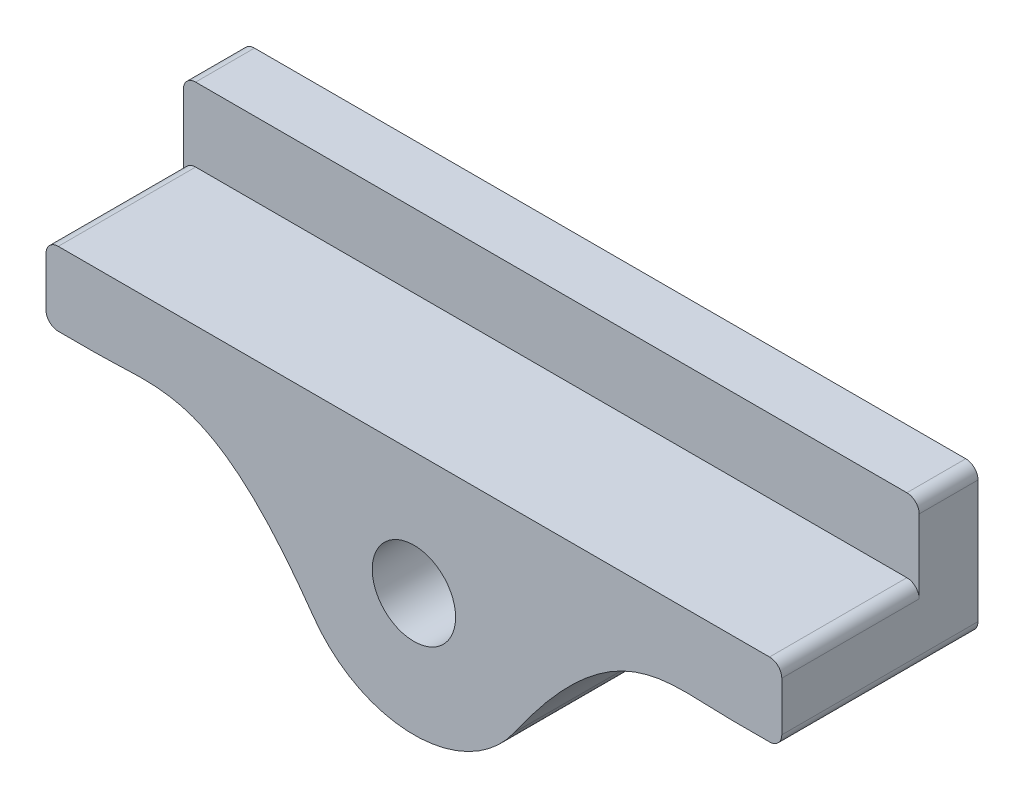
ISO-10303-21;
HEADER;
FILE_DESCRIPTION(('STEP AP214'),'2;1');
FILE_NAME('part.step','',(''),(''),'','','');
FILE_SCHEMA(('AUTOMOTIVE_DESIGN { 1 0 10303 214 1 1 1 1 }'));
ENDSEC;
DATA;
#1=APPLICATION_CONTEXT('core data for automotive mechanical design processes');
#2=APPLICATION_PROTOCOL_DEFINITION('international standard','automotive_design',2000,#1);
#3=PRODUCT_CONTEXT('',#1,'mechanical');
#4=PRODUCT('Part','Part','',(#3));
#5=PRODUCT_RELATED_PRODUCT_CATEGORY('part','',(#4));
#6=PRODUCT_DEFINITION_FORMATION('','',#4);
#7=PRODUCT_DEFINITION_CONTEXT('part definition',#1,'design');
#8=PRODUCT_DEFINITION('design','',#6,#7);
#9=PRODUCT_DEFINITION_SHAPE('','',#8);
#10=(LENGTH_UNIT() NAMED_UNIT(*) SI_UNIT(.MILLI.,.METRE.));
#11=(NAMED_UNIT(*) PLANE_ANGLE_UNIT() SI_UNIT($,.RADIAN.));
#12=(NAMED_UNIT(*) SI_UNIT($,.STERADIAN.) SOLID_ANGLE_UNIT());
#13=UNCERTAINTY_MEASURE_WITH_UNIT(LENGTH_MEASURE(1.E-05),#10,'distance_accuracy_value','');
#14=(GEOMETRIC_REPRESENTATION_CONTEXT(3) GLOBAL_UNCERTAINTY_ASSIGNED_CONTEXT((#13)) GLOBAL_UNIT_ASSIGNED_CONTEXT((#10,
#11,#12)) REPRESENTATION_CONTEXT('',''));
#15=CARTESIAN_POINT('',(0.,0.,0.));
#16=DIRECTION('',(0.,0.,1.));
#17=DIRECTION('',(1.,0.,0.));
#18=AXIS2_PLACEMENT_3D('',#15,#16,#17);
#19=CARTESIAN_POINT('',(5.,-2.,1.));
#20=DIRECTION('',(0.,0.,-1.));
#21=DIRECTION('',(-1.,0.,0.));
#22=AXIS2_PLACEMENT_3D('',#19,#20,#21);
#23=CYLINDRICAL_SURFACE('',#22,3.7);
#24=CARTESIAN_POINT('',(5.,-2.,0.));
#25=DIRECTION('',(0.,0.,-1.));
#26=DIRECTION('',(-1.,0.,0.));
#27=AXIS2_PLACEMENT_3D('',#24,#25,#26);
#28=CIRCLE('',#27,3.7);
#29=CARTESIAN_POINT('',(1.3,-2.,0.));
#30=VERTEX_POINT('',#29);
#31=EDGE_CURVE('E410',#30,#30,#28,.T.);
#32=ORIENTED_EDGE('',*,*,#31,.T.);
#33=EDGE_LOOP('',(#32));
#34=FACE_BOUND('',#33,.T.);
#35=CARTESIAN_POINT('',(5.,-2.,0.6));
#36=DIRECTION('',(0.,0.,1.));
#37=DIRECTION('',(1.,0.,0.));
#38=AXIS2_PLACEMENT_3D('',#35,#36,#37);
#39=CIRCLE('',#38,3.7);
#40=CARTESIAN_POINT('',(8.7,-2.,0.6));
#41=VERTEX_POINT('',#40);
#42=EDGE_CURVE('E11',#41,#41,#39,.F.);
#43=ORIENTED_EDGE('',*,*,#42,.F.);
#44=EDGE_LOOP('',(#43));
#45=FACE_BOUND('',#44,.T.);
#46=ADVANCED_FACE('F35',(#34,#45),#23,.F.);
#47=CARTESIAN_POINT('',(5.,-2.,8.));
#48=DIRECTION('',(0.,0.,-1.));
#49=DIRECTION('',(-1.,0.,0.));
#50=AXIS2_PLACEMENT_3D('',#47,#48,#49);
#51=CYLINDRICAL_SURFACE('',#50,1.7);
#52=CARTESIAN_POINT('',(5.,-2.,3.4));
#53=DIRECTION('',(0.,0.,1.));
#54=DIRECTION('',(1.,0.,0.));
#55=AXIS2_PLACEMENT_3D('',#52,#53,#54);
#56=CIRCLE('',#55,1.7);
#57=CARTESIAN_POINT('',(6.7,-2.,3.4));
#58=VERTEX_POINT('',#57);
#59=EDGE_CURVE('E45',#58,#58,#56,.T.);
#60=ORIENTED_EDGE('',*,*,#59,.F.);
#61=EDGE_LOOP('',(#60));
#62=FACE_BOUND('',#61,.T.);
#63=CARTESIAN_POINT('',(5.,-2.,8.));
#64=DIRECTION('',(0.,0.,1.));
#65=DIRECTION('',(1.,0.,0.));
#66=AXIS2_PLACEMENT_3D('',#63,#64,#65);
#67=CIRCLE('',#66,1.7);
#68=CARTESIAN_POINT('',(6.7,-2.,8.));
#69=VERTEX_POINT('',#68);
#70=EDGE_CURVE('E290',#69,#69,#67,.T.);
#71=ORIENTED_EDGE('',*,*,#70,.T.);
#72=EDGE_LOOP('',(#71));
#73=FACE_BOUND('',#72,.T.);
#74=ADVANCED_FACE('F239',(#62,#73),#51,.F.);
#75=CARTESIAN_POINT('',(-4.03421233914941,-0.267444983879889,8.));
#76=DIRECTION('',(0.,0.,-1.));
#77=DIRECTION('',(-1.,0.,0.));
#78=AXIS2_PLACEMENT_3D('',#75,#76,#77);
#79=PLANE('',#78);
#80=DIRECTION('',(0.,-1.,0.));
#81=VECTOR('',#80,1.);
#82=CARTESIAN_POINT('',(-10.,6.,8.));
#83=LINE('',#82,#81);
#84=CARTESIAN_POINT('',(-10.,2.5,8.));
#85=VERTEX_POINT('',#84);
#86=CARTESIAN_POINT('',(-10.,0.5,8.));
#87=VERTEX_POINT('',#86);
#88=EDGE_CURVE('E163',#85,#87,#83,.T.);
#89=ORIENTED_EDGE('',*,*,#88,.T.);
#90=CARTESIAN_POINT('',(-9.5,0.5,8.));
#91=DIRECTION('',(0.,0.,-1.));
#92=DIRECTION('',(-1.,0.,0.));
#93=AXIS2_PLACEMENT_3D('',#90,#91,#92);
#94=CIRCLE('',#93,0.5);
#95=CARTESIAN_POINT('',(-9.5,0.,8.));
#96=VERTEX_POINT('',#95);
#97=EDGE_CURVE('E159',#87,#96,#94,.F.);
#98=ORIENTED_EDGE('',*,*,#97,.T.);
#99=DIRECTION('',(1.,0.,0.));
#100=VECTOR('',#99,1.);
#101=CARTESIAN_POINT('',(-8.,0.,8.));
#102=LINE('',#101,#100);
#103=CARTESIAN_POINT('',(-8.,0.,8.));
#104=VERTEX_POINT('',#103);
#105=EDGE_CURVE('E150',#96,#104,#102,.T.);
#106=ORIENTED_EDGE('',*,*,#105,.T.);
#107=CARTESIAN_POINT('',(-8.,0.,8.));
#108=CARTESIAN_POINT('',(-5.26031875300334,0.,8.));
#109=CARTESIAN_POINT('',(-3.13135456391697,0.908049893895382,8.));
#110=CARTESIAN_POINT('',(0.901321237565681,-4.86370955272525,8.));
#111=B_SPLINE_CURVE_WITH_KNOTS('',3,(#107,#108,#109,#110),.UNSPECIFIED.,.F.,.F.,(4,4),(0.,1.),.UNSPECIFIED.);
#112=CARTESIAN_POINT('',(0.901321237565678,-4.86370955272525,8.));
#113=VERTEX_POINT('',#112);
#114=EDGE_CURVE('E156',#104,#113,#111,.T.);
#115=ORIENTED_EDGE('',*,*,#114,.T.);
#116=CARTESIAN_POINT('',(5.,-2.,8.));
#117=DIRECTION('',(0.,0.,1.));
#118=DIRECTION('',(1.,0.,0.));
#119=AXIS2_PLACEMENT_3D('',#116,#117,#118);
#120=CIRCLE('',#119,5.);
#121=CARTESIAN_POINT('',(9.09867876243432,-4.86370955272525,8.));
#122=VERTEX_POINT('',#121);
#123=EDGE_CURVE('E178',#113,#122,#120,.T.);
#124=ORIENTED_EDGE('',*,*,#123,.T.);
#125=CARTESIAN_POINT('',(9.09867876243432,-4.86370955272525,8.));
#126=CARTESIAN_POINT('',(13.131354563917,0.908049893895381,8.));
#127=CARTESIAN_POINT('',(15.2603187530033,0.,8.));
#128=CARTESIAN_POINT('',(18.,0.,8.));
#129=B_SPLINE_CURVE_WITH_KNOTS('',3,(#125,#126,#127,#128),.UNSPECIFIED.,.F.,.F.,(4,4),(0.,1.),.UNSPECIFIED.);
#130=CARTESIAN_POINT('',(18.,0.,8.));
#131=VERTEX_POINT('',#130);
#132=EDGE_CURVE('E180',#122,#131,#129,.T.);
#133=ORIENTED_EDGE('',*,*,#132,.T.);
#134=DIRECTION('',(1.,0.,0.));
#135=VECTOR('',#134,1.);
#136=CARTESIAN_POINT('',(18.,0.,8.));
#137=LINE('',#136,#135);
#138=CARTESIAN_POINT('',(19.5,0.,8.));
#139=VERTEX_POINT('',#138);
#140=EDGE_CURVE('E276',#131,#139,#137,.T.);
#141=ORIENTED_EDGE('',*,*,#140,.T.);
#142=CARTESIAN_POINT('',(19.5,0.5,8.));
#143=DIRECTION('',(0.,0.,-1.));
#144=DIRECTION('',(-1.,0.,0.));
#145=AXIS2_PLACEMENT_3D('',#142,#143,#144);
#146=CIRCLE('',#145,0.5);
#147=CARTESIAN_POINT('',(20.,0.5,8.));
#148=VERTEX_POINT('',#147);
#149=EDGE_CURVE('E343',#139,#148,#146,.F.);
#150=ORIENTED_EDGE('',*,*,#149,.T.);
#151=DIRECTION('',(0.,1.,0.));
#152=VECTOR('',#151,1.);
#153=CARTESIAN_POINT('',(20.,6.,8.));
#154=LINE('',#153,#152);
#155=CARTESIAN_POINT('',(20.,2.5,8.));
#156=VERTEX_POINT('',#155);
#157=EDGE_CURVE('E282',#148,#156,#154,.T.);
#158=ORIENTED_EDGE('',*,*,#157,.T.);
#159=CARTESIAN_POINT('',(19.5,2.5,8.));
#160=DIRECTION('',(0.,0.,-1.));
#161=DIRECTION('',(-1.,0.,0.));
#162=AXIS2_PLACEMENT_3D('',#159,#160,#161);
#163=CIRCLE('',#162,0.5);
#164=CARTESIAN_POINT('',(19.5,3.,8.));
#165=VERTEX_POINT('',#164);
#166=EDGE_CURVE('E341',#156,#165,#163,.F.);
#167=ORIENTED_EDGE('',*,*,#166,.T.);
#168=DIRECTION('',(1.,0.,0.));
#169=VECTOR('',#168,1.);
#170=CARTESIAN_POINT('',(-10.,3.,8.));
#171=LINE('',#170,#169);
#172=CARTESIAN_POINT('',(-9.5,3.,8.));
#173=VERTEX_POINT('',#172);
#174=EDGE_CURVE('E385',#173,#165,#171,.T.);
#175=ORIENTED_EDGE('',*,*,#174,.F.);
#176=CARTESIAN_POINT('',(-9.5,2.5,8.));
#177=DIRECTION('',(0.,0.,-1.));
#178=DIRECTION('',(-1.,0.,0.));
#179=AXIS2_PLACEMENT_3D('',#176,#177,#178);
#180=CIRCLE('',#179,0.5);
#181=EDGE_CURVE('E339',#173,#85,#180,.F.);
#182=ORIENTED_EDGE('',*,*,#181,.T.);
#183=EDGE_LOOP('',(#89,#98,#106,#115,#124,#133,#141,#150,#158,#167,#175,#182));
#184=FACE_BOUND('',#183,.T.);
#185=ORIENTED_EDGE('',*,*,#70,.F.);
#186=EDGE_LOOP('',(#185));
#187=FACE_BOUND('',#186,.T.);
#188=ADVANCED_FACE('F153',(#184,#187),#79,.F.);
#189=CARTESIAN_POINT('',(-4.03421233914941,-0.267444983879889,0.));
#190=DIRECTION('',(0.,0.,-1.));
#191=DIRECTION('',(-1.,0.,0.));
#192=AXIS2_PLACEMENT_3D('',#189,#190,#191);
#193=PLANE('',#192);
#194=ORIENTED_EDGE('',*,*,#31,.F.);
#195=EDGE_LOOP('',(#194));
#196=FACE_BOUND('',#195,.T.);
#197=DIRECTION('',(1.,0.,0.));
#198=VECTOR('',#197,1.);
#199=CARTESIAN_POINT('',(-8.,0.,0.));
#200=LINE('',#199,#198);
#201=CARTESIAN_POINT('',(-9.5,0.,0.));
#202=VERTEX_POINT('',#201);
#203=CARTESIAN_POINT('',(-8.,0.,0.));
#204=VERTEX_POINT('',#203);
#205=EDGE_CURVE('E169',#202,#204,#200,.T.);
#206=ORIENTED_EDGE('',*,*,#205,.F.);
#207=CARTESIAN_POINT('',(-9.5,0.5,0.));
#208=DIRECTION('',(0.,0.,-1.));
#209=DIRECTION('',(-1.,0.,0.));
#210=AXIS2_PLACEMENT_3D('',#207,#208,#209);
#211=CIRCLE('',#210,0.5);
#212=CARTESIAN_POINT('',(-10.,0.5,0.));
#213=VERTEX_POINT('',#212);
#214=EDGE_CURVE('E329',#202,#213,#211,.T.);
#215=ORIENTED_EDGE('',*,*,#214,.T.);
#216=DIRECTION('',(0.,-1.,0.));
#217=VECTOR('',#216,1.);
#218=CARTESIAN_POINT('',(-10.,6.,0.));
#219=LINE('',#218,#217);
#220=CARTESIAN_POINT('',(-10.,5.5,0.));
#221=VERTEX_POINT('',#220);
#222=EDGE_CURVE('E289',#221,#213,#219,.T.);
#223=ORIENTED_EDGE('',*,*,#222,.F.);
#224=CARTESIAN_POINT('',(-9.5,5.5,0.));
#225=DIRECTION('',(0.,0.,-1.));
#226=DIRECTION('',(-1.,0.,0.));
#227=AXIS2_PLACEMENT_3D('',#224,#225,#226);
#228=CIRCLE('',#227,0.5);
#229=CARTESIAN_POINT('',(-9.5,6.,0.));
#230=VERTEX_POINT('',#229);
#231=EDGE_CURVE('E323',#221,#230,#228,.T.);
#232=ORIENTED_EDGE('',*,*,#231,.T.);
#233=DIRECTION('',(-1.,0.,0.));
#234=VECTOR('',#233,1.);
#235=CARTESIAN_POINT('',(20.,6.,0.));
#236=LINE('',#235,#234);
#237=CARTESIAN_POINT('',(19.5,6.,0.));
#238=VERTEX_POINT('',#237);
#239=EDGE_CURVE('E286',#238,#230,#236,.T.);
#240=ORIENTED_EDGE('',*,*,#239,.F.);
#241=CARTESIAN_POINT('',(19.5,5.5,0.));
#242=DIRECTION('',(0.,0.,-1.));
#243=DIRECTION('',(-1.,0.,0.));
#244=AXIS2_PLACEMENT_3D('',#241,#242,#243);
#245=CIRCLE('',#244,0.5);
#246=CARTESIAN_POINT('',(20.,5.5,0.));
#247=VERTEX_POINT('',#246);
#248=EDGE_CURVE('E325',#238,#247,#245,.T.);
#249=ORIENTED_EDGE('',*,*,#248,.T.);
#250=DIRECTION('',(0.,1.,0.));
#251=VECTOR('',#250,1.);
#252=CARTESIAN_POINT('',(20.,6.,0.));
#253=LINE('',#252,#251);
#254=CARTESIAN_POINT('',(20.,0.5,0.));
#255=VERTEX_POINT('',#254);
#256=EDGE_CURVE('E313',#255,#247,#253,.T.);
#257=ORIENTED_EDGE('',*,*,#256,.F.);
#258=CARTESIAN_POINT('',(19.5,0.5,0.));
#259=DIRECTION('',(0.,0.,-1.));
#260=DIRECTION('',(-1.,0.,0.));
#261=AXIS2_PLACEMENT_3D('',#258,#259,#260);
#262=CIRCLE('',#261,0.5);
#263=CARTESIAN_POINT('',(19.5,0.,0.));
#264=VERTEX_POINT('',#263);
#265=EDGE_CURVE('E327',#255,#264,#262,.T.);
#266=ORIENTED_EDGE('',*,*,#265,.T.);
#267=DIRECTION('',(1.,0.,0.));
#268=VECTOR('',#267,1.);
#269=CARTESIAN_POINT('',(18.,0.,0.));
#270=LINE('',#269,#268);
#271=CARTESIAN_POINT('',(18.,0.,0.));
#272=VERTEX_POINT('',#271);
#273=EDGE_CURVE('E307',#272,#264,#270,.T.);
#274=ORIENTED_EDGE('',*,*,#273,.F.);
#275=CARTESIAN_POINT('',(9.09867876243432,-4.86370955272525,0.));
#276=CARTESIAN_POINT('',(13.131354563917,0.908049893895381,0.));
#277=CARTESIAN_POINT('',(15.2603187530033,0.,0.));
#278=CARTESIAN_POINT('',(18.,0.,0.));
#279=B_SPLINE_CURVE_WITH_KNOTS('',3,(#275,#276,#277,#278),.UNSPECIFIED.,.F.,.F.,(4,4),(0.,1.),.UNSPECIFIED.);
#280=CARTESIAN_POINT('',(9.09867876243432,-4.86370955272525,0.));
#281=VERTEX_POINT('',#280);
#282=EDGE_CURVE('E303',#281,#272,#279,.T.);
#283=ORIENTED_EDGE('',*,*,#282,.F.);
#284=CARTESIAN_POINT('',(5.,-2.,0.));
#285=DIRECTION('',(0.,0.,1.));
#286=DIRECTION('',(1.,0.,0.));
#287=AXIS2_PLACEMENT_3D('',#284,#285,#286);
#288=CIRCLE('',#287,5.);
#289=CARTESIAN_POINT('',(0.901321237565678,-4.86370955272525,0.));
#290=VERTEX_POINT('',#289);
#291=EDGE_CURVE('E298',#290,#281,#288,.T.);
#292=ORIENTED_EDGE('',*,*,#291,.F.);
#293=CARTESIAN_POINT('',(-8.,0.,0.));
#294=CARTESIAN_POINT('',(-5.26031875300334,0.,0.));
#295=CARTESIAN_POINT('',(-3.13135456391697,0.908049893895382,0.));
#296=CARTESIAN_POINT('',(0.901321237565681,-4.86370955272525,0.));
#297=B_SPLINE_CURVE_WITH_KNOTS('',3,(#293,#294,#295,#296),.UNSPECIFIED.,.F.,.F.,(4,4),(0.,1.),.UNSPECIFIED.);
#298=EDGE_CURVE('E294',#204,#290,#297,.T.);
#299=ORIENTED_EDGE('',*,*,#298,.F.);
#300=EDGE_LOOP('',(#206,#215,#223,#232,#240,#249,#257,#266,#274,#283,#292,#299));
#301=FACE_BOUND('',#300,.T.);
#302=ADVANCED_FACE('F205',(#196,#301),#193,.T.);
#303=CARTESIAN_POINT('',(20.,6.,8.));
#304=DIRECTION('',(0.,-1.,0.));
#305=DIRECTION('',(0.,0.,-1.));
#306=AXIS2_PLACEMENT_3D('',#303,#304,#305);
#307=PLANE('',#306);
#308=DIRECTION('',(-1.,0.,0.));
#309=VECTOR('',#308,1.);
#310=CARTESIAN_POINT('',(-10.,6.,2.4));
#311=LINE('',#310,#309);
#312=CARTESIAN_POINT('',(19.5,6.,2.4));
#313=VERTEX_POINT('',#312);
#314=CARTESIAN_POINT('',(-9.5,6.,2.4));
#315=VERTEX_POINT('',#314);
#316=EDGE_CURVE('E411',#313,#315,#311,.T.);
#317=ORIENTED_EDGE('',*,*,#316,.F.);
#318=DIRECTION('',(0.,0.,-1.));
#319=VECTOR('',#318,1.);
#320=CARTESIAN_POINT('',(19.5,6.,8.));
#321=LINE('',#320,#319);
#322=EDGE_CURVE('E358',#313,#238,#321,.T.);
#323=ORIENTED_EDGE('',*,*,#322,.T.);
#324=ORIENTED_EDGE('',*,*,#239,.T.);
#325=DIRECTION('',(0.,0.,-1.));
#326=VECTOR('',#325,1.);
#327=CARTESIAN_POINT('',(-9.5,6.,8.));
#328=LINE('',#327,#326);
#329=EDGE_CURVE('E356',#230,#315,#328,.F.);
#330=ORIENTED_EDGE('',*,*,#329,.T.);
#331=EDGE_LOOP('',(#317,#323,#324,#330));
#332=FACE_BOUND('',#331,.T.);
#333=ADVANCED_FACE('F201',(#332),#307,.F.);
#334=CARTESIAN_POINT('',(-10.,6.,8.));
#335=DIRECTION('',(1.,0.,0.));
#336=DIRECTION('',(0.,1.,0.));
#337=AXIS2_PLACEMENT_3D('',#334,#335,#336);
#338=PLANE('',#337);
#339=ORIENTED_EDGE('',*,*,#222,.T.);
#340=DIRECTION('',(0.,0.,-1.));
#341=VECTOR('',#340,1.);
#342=CARTESIAN_POINT('',(-10.,0.5,8.));
#343=LINE('',#342,#341);
#344=EDGE_CURVE('E337',#213,#87,#343,.F.);
#345=ORIENTED_EDGE('',*,*,#344,.T.);
#346=ORIENTED_EDGE('',*,*,#88,.F.);
#347=DIRECTION('',(0.,0.,1.));
#348=VECTOR('',#347,1.);
#349=CARTESIAN_POINT('',(-10.,2.5,8.));
#350=LINE('',#349,#348);
#351=CARTESIAN_POINT('',(-10.,2.5,2.4));
#352=VERTEX_POINT('',#351);
#353=EDGE_CURVE('E334',#85,#352,#350,.F.);
#354=ORIENTED_EDGE('',*,*,#353,.T.);
#355=DIRECTION('',(0.,-1.,0.));
#356=VECTOR('',#355,1.);
#357=CARTESIAN_POINT('',(-10.,3.,2.4));
#358=LINE('',#357,#356);
#359=CARTESIAN_POINT('',(-10.,5.5,2.4));
#360=VERTEX_POINT('',#359);
#361=EDGE_CURVE('E382',#360,#352,#358,.T.);
#362=ORIENTED_EDGE('',*,*,#361,.F.);
#363=DIRECTION('',(0.,0.,-1.));
#364=VECTOR('',#363,1.);
#365=CARTESIAN_POINT('',(-10.,5.5,8.));
#366=LINE('',#365,#364);
#367=EDGE_CURVE('E331',#360,#221,#366,.T.);
#368=ORIENTED_EDGE('',*,*,#367,.T.);
#369=EDGE_LOOP('',(#339,#345,#346,#354,#362,#368));
#370=FACE_BOUND('',#369,.T.);
#371=ADVANCED_FACE('F198',(#370),#338,.F.);
#372=CARTESIAN_POINT('',(-8.,0.,8.));
#373=DIRECTION('',(0.,1.,0.));
#374=DIRECTION('',(0.,0.,1.));
#375=AXIS2_PLACEMENT_3D('',#372,#373,#374);
#376=PLANE('',#375);
#377=ORIENTED_EDGE('',*,*,#105,.F.);
#378=DIRECTION('',(0.,0.,-1.));
#379=VECTOR('',#378,1.);
#380=CARTESIAN_POINT('',(-9.5,0.,8.));
#381=LINE('',#380,#379);
#382=EDGE_CURVE('E172',#96,#202,#381,.T.);
#383=ORIENTED_EDGE('',*,*,#382,.T.);
#384=ORIENTED_EDGE('',*,*,#205,.T.);
#385=DIRECTION('',(0.,0.,-1.));
#386=VECTOR('',#385,1.);
#387=CARTESIAN_POINT('',(-8.,0.,8.));
#388=LINE('',#387,#386);
#389=EDGE_CURVE('E166',#104,#204,#388,.T.);
#390=ORIENTED_EDGE('',*,*,#389,.F.);
#391=EDGE_LOOP('',(#377,#383,#384,#390));
#392=FACE_BOUND('',#391,.T.);
#393=ADVANCED_FACE('F167',(#392),#376,.F.);
#394=DIRECTION('',(0.,0.,-1.));
#395=VECTOR('',#394,1.);
#396=SURFACE_OF_LINEAR_EXTRUSION('',#111,#395);
#397=ORIENTED_EDGE('',*,*,#298,.T.);
#398=DIRECTION('',(0.,0.,-1.));
#399=VECTOR('',#398,1.);
#400=CARTESIAN_POINT('',(0.901321237565678,-4.86370955272525,8.));
#401=LINE('',#400,#399);
#402=EDGE_CURVE('E173',#113,#290,#401,.T.);
#403=ORIENTED_EDGE('',*,*,#402,.F.);
#404=ORIENTED_EDGE('',*,*,#114,.F.);
#405=ORIENTED_EDGE('',*,*,#389,.T.);
#406=EDGE_LOOP('',(#397,#403,#404,#405));
#407=FACE_BOUND('',#406,.T.);
#408=ADVANCED_FACE('F175',(#407),#396,.F.);
#409=CARTESIAN_POINT('',(5.,-2.,8.));
#410=DIRECTION('',(0.,0.,-1.));
#411=DIRECTION('',(-1.,0.,0.));
#412=AXIS2_PLACEMENT_3D('',#409,#410,#411);
#413=CYLINDRICAL_SURFACE('',#412,5.);
#414=ORIENTED_EDGE('',*,*,#291,.T.);
#415=DIRECTION('',(0.,0.,-1.));
#416=VECTOR('',#415,1.);
#417=CARTESIAN_POINT('',(9.09867876243432,-4.86370955272525,8.));
#418=LINE('',#417,#416);
#419=EDGE_CURVE('E318',#122,#281,#418,.T.);
#420=ORIENTED_EDGE('',*,*,#419,.F.);
#421=ORIENTED_EDGE('',*,*,#123,.F.);
#422=ORIENTED_EDGE('',*,*,#402,.T.);
#423=EDGE_LOOP('',(#414,#420,#421,#422));
#424=FACE_BOUND('',#423,.T.);
#425=ADVANCED_FACE('F194',(#424),#413,.T.);
#426=DIRECTION('',(0.,0.,-1.));
#427=VECTOR('',#426,1.);
#428=SURFACE_OF_LINEAR_EXTRUSION('',#129,#427);
#429=ORIENTED_EDGE('',*,*,#282,.T.);
#430=DIRECTION('',(0.,0.,-1.));
#431=VECTOR('',#430,1.);
#432=CARTESIAN_POINT('',(18.,0.,8.));
#433=LINE('',#432,#431);
#434=EDGE_CURVE('E285',#131,#272,#433,.T.);
#435=ORIENTED_EDGE('',*,*,#434,.F.);
#436=ORIENTED_EDGE('',*,*,#132,.F.);
#437=ORIENTED_EDGE('',*,*,#419,.T.);
#438=EDGE_LOOP('',(#429,#435,#436,#437));
#439=FACE_BOUND('',#438,.T.);
#440=ADVANCED_FACE('F268',(#439),#428,.F.);
#441=CARTESIAN_POINT('',(18.,0.,8.));
#442=DIRECTION('',(0.,1.,0.));
#443=DIRECTION('',(0.,0.,1.));
#444=AXIS2_PLACEMENT_3D('',#441,#442,#443);
#445=PLANE('',#444);
#446=ORIENTED_EDGE('',*,*,#273,.T.);
#447=DIRECTION('',(0.,0.,-1.));
#448=VECTOR('',#447,1.);
#449=CARTESIAN_POINT('',(19.5,0.,8.));
#450=LINE('',#449,#448);
#451=EDGE_CURVE('E354',#264,#139,#450,.F.);
#452=ORIENTED_EDGE('',*,*,#451,.T.);
#453=ORIENTED_EDGE('',*,*,#140,.F.);
#454=ORIENTED_EDGE('',*,*,#434,.T.);
#455=EDGE_LOOP('',(#446,#452,#453,#454));
#456=FACE_BOUND('',#455,.T.);
#457=ADVANCED_FACE('F265',(#456),#445,.F.);
#458=CARTESIAN_POINT('',(20.,6.,8.));
#459=DIRECTION('',(-1.,0.,0.));
#460=DIRECTION('',(0.,0.,1.));
#461=AXIS2_PLACEMENT_3D('',#458,#459,#460);
#462=PLANE('',#461);
#463=ORIENTED_EDGE('',*,*,#157,.F.);
#464=DIRECTION('',(0.,0.,-1.));
#465=VECTOR('',#464,1.);
#466=CARTESIAN_POINT('',(20.,0.5,8.));
#467=LINE('',#466,#465);
#468=EDGE_CURVE('E351',#148,#255,#467,.T.);
#469=ORIENTED_EDGE('',*,*,#468,.T.);
#470=ORIENTED_EDGE('',*,*,#256,.T.);
#471=DIRECTION('',(0.,0.,-1.));
#472=VECTOR('',#471,1.);
#473=CARTESIAN_POINT('',(20.,5.5,8.));
#474=LINE('',#473,#472);
#475=CARTESIAN_POINT('',(20.,5.5,2.4));
#476=VERTEX_POINT('',#475);
#477=EDGE_CURVE('E349',#247,#476,#474,.F.);
#478=ORIENTED_EDGE('',*,*,#477,.T.);
#479=DIRECTION('',(0.,1.,0.));
#480=VECTOR('',#479,1.);
#481=CARTESIAN_POINT('',(20.,3.,2.4));
#482=LINE('',#481,#480);
#483=CARTESIAN_POINT('',(20.,2.5,2.4));
#484=VERTEX_POINT('',#483);
#485=EDGE_CURVE('E407',#484,#476,#482,.T.);
#486=ORIENTED_EDGE('',*,*,#485,.F.);
#487=DIRECTION('',(0.,0.,1.));
#488=VECTOR('',#487,1.);
#489=CARTESIAN_POINT('',(20.,2.5,8.));
#490=LINE('',#489,#488);
#491=EDGE_CURVE('E346',#484,#156,#490,.T.);
#492=ORIENTED_EDGE('',*,*,#491,.T.);
#493=EDGE_LOOP('',(#463,#469,#470,#478,#486,#492));
#494=FACE_BOUND('',#493,.T.);
#495=ADVANCED_FACE('F256',(#494),#462,.F.);
#496=CARTESIAN_POINT('',(-10.,3.,2.4));
#497=DIRECTION('',(0.,-1.,0.));
#498=DIRECTION('',(0.,0.,-1.));
#499=AXIS2_PLACEMENT_3D('',#496,#497,#498);
#500=PLANE('',#499);
#501=ORIENTED_EDGE('',*,*,#174,.T.);
#502=DIRECTION('',(0.,0.,1.));
#503=VECTOR('',#502,1.);
#504=CARTESIAN_POINT('',(19.5,3.,2.4));
#505=LINE('',#504,#503);
#506=CARTESIAN_POINT('',(19.5,3.,2.4));
#507=VERTEX_POINT('',#506);
#508=EDGE_CURVE('E52',#165,#507,#505,.F.);
#509=ORIENTED_EDGE('',*,*,#508,.T.);
#510=DIRECTION('',(1.,0.,0.));
#511=VECTOR('',#510,1.);
#512=CARTESIAN_POINT('',(-10.,3.,2.4));
#513=LINE('',#512,#511);
#514=CARTESIAN_POINT('',(-9.5,3.,2.4));
#515=VERTEX_POINT('',#514);
#516=EDGE_CURVE('E380',#515,#507,#513,.T.);
#517=ORIENTED_EDGE('',*,*,#516,.F.);
#518=DIRECTION('',(0.,0.,1.));
#519=VECTOR('',#518,1.);
#520=CARTESIAN_POINT('',(-9.5,3.,2.4));
#521=LINE('',#520,#519);
#522=EDGE_CURVE('E365',#515,#173,#521,.T.);
#523=ORIENTED_EDGE('',*,*,#522,.T.);
#524=EDGE_LOOP('',(#501,#509,#517,#523));
#525=FACE_BOUND('',#524,.T.);
#526=ADVANCED_FACE('F254',(#525),#500,.F.);
#527=CARTESIAN_POINT('',(0.,0.,2.4));
#528=DIRECTION('',(0.,0.,-1.));
#529=DIRECTION('',(-1.,0.,0.));
#530=AXIS2_PLACEMENT_3D('',#527,#528,#529);
#531=PLANE('',#530);
#532=ORIENTED_EDGE('',*,*,#485,.T.);
#533=CARTESIAN_POINT('',(19.5,5.5,2.4));
#534=DIRECTION('',(0.,0.,-1.));
#535=DIRECTION('',(-1.,0.,0.));
#536=AXIS2_PLACEMENT_3D('',#533,#534,#535);
#537=CIRCLE('',#536,0.5);
#538=EDGE_CURVE('E363',#476,#313,#537,.F.);
#539=ORIENTED_EDGE('',*,*,#538,.T.);
#540=ORIENTED_EDGE('',*,*,#316,.T.);
#541=CARTESIAN_POINT('',(-9.5,5.5,2.4));
#542=DIRECTION('',(0.,0.,-1.));
#543=DIRECTION('',(-1.,0.,0.));
#544=AXIS2_PLACEMENT_3D('',#541,#542,#543);
#545=CIRCLE('',#544,0.5);
#546=EDGE_CURVE('E361',#315,#360,#545,.F.);
#547=ORIENTED_EDGE('',*,*,#546,.T.);
#548=ORIENTED_EDGE('',*,*,#361,.T.);
#549=CARTESIAN_POINT('',(-9.5,2.5,2.4));
#550=DIRECTION('',(0.,0.,-1.));
#551=DIRECTION('',(-1.,0.,0.));
#552=AXIS2_PLACEMENT_3D('',#549,#550,#551);
#553=CIRCLE('',#552,0.5);
#554=EDGE_CURVE('E59',#352,#515,#553,.T.);
#555=ORIENTED_EDGE('',*,*,#554,.T.);
#556=ORIENTED_EDGE('',*,*,#516,.T.);
#557=CARTESIAN_POINT('',(19.5,2.5,2.4));
#558=DIRECTION('',(0.,0.,-1.));
#559=DIRECTION('',(-1.,0.,0.));
#560=AXIS2_PLACEMENT_3D('',#557,#558,#559);
#561=CIRCLE('',#560,0.5);
#562=EDGE_CURVE('E369',#507,#484,#561,.T.);
#563=ORIENTED_EDGE('',*,*,#562,.T.);
#564=EDGE_LOOP('',(#532,#539,#540,#547,#548,#555,#556,#563));
#565=FACE_BOUND('',#564,.T.);
#566=ADVANCED_FACE('F211',(#565),#531,.F.);
#567=CARTESIAN_POINT('',(-9.5,0.5,8.));
#568=DIRECTION('',(0.,0.,-1.));
#569=DIRECTION('',(-1.,0.,0.));
#570=AXIS2_PLACEMENT_3D('',#567,#568,#569);
#571=CYLINDRICAL_SURFACE('',#570,0.5);
#572=ORIENTED_EDGE('',*,*,#97,.F.);
#573=ORIENTED_EDGE('',*,*,#344,.F.);
#574=ORIENTED_EDGE('',*,*,#214,.F.);
#575=ORIENTED_EDGE('',*,*,#382,.F.);
#576=EDGE_LOOP('',(#572,#573,#574,#575));
#577=FACE_BOUND('',#576,.T.);
#578=ADVANCED_FACE('F207',(#577),#571,.T.);
#579=CARTESIAN_POINT('',(19.5,0.5,8.));
#580=DIRECTION('',(0.,0.,-1.));
#581=DIRECTION('',(-1.,0.,0.));
#582=AXIS2_PLACEMENT_3D('',#579,#580,#581);
#583=CYLINDRICAL_SURFACE('',#582,0.5);
#584=ORIENTED_EDGE('',*,*,#149,.F.);
#585=ORIENTED_EDGE('',*,*,#451,.F.);
#586=ORIENTED_EDGE('',*,*,#265,.F.);
#587=ORIENTED_EDGE('',*,*,#468,.F.);
#588=EDGE_LOOP('',(#584,#585,#586,#587));
#589=FACE_BOUND('',#588,.T.);
#590=ADVANCED_FACE('F210',(#589),#583,.T.);
#591=CARTESIAN_POINT('',(19.5,5.5,8.));
#592=DIRECTION('',(0.,0.,-1.));
#593=DIRECTION('',(-1.,0.,0.));
#594=AXIS2_PLACEMENT_3D('',#591,#592,#593);
#595=CYLINDRICAL_SURFACE('',#594,0.5);
#596=ORIENTED_EDGE('',*,*,#538,.F.);
#597=ORIENTED_EDGE('',*,*,#477,.F.);
#598=ORIENTED_EDGE('',*,*,#248,.F.);
#599=ORIENTED_EDGE('',*,*,#322,.F.);
#600=EDGE_LOOP('',(#596,#597,#598,#599));
#601=FACE_BOUND('',#600,.T.);
#602=ADVANCED_FACE('F215',(#601),#595,.T.);
#603=CARTESIAN_POINT('',(19.5,2.5,8.));
#604=DIRECTION('',(0.,0.,1.));
#605=DIRECTION('',(1.,0.,0.));
#606=AXIS2_PLACEMENT_3D('',#603,#604,#605);
#607=CYLINDRICAL_SURFACE('',#606,0.5);
#608=ORIENTED_EDGE('',*,*,#562,.F.);
#609=ORIENTED_EDGE('',*,*,#508,.F.);
#610=ORIENTED_EDGE('',*,*,#166,.F.);
#611=ORIENTED_EDGE('',*,*,#491,.F.);
#612=EDGE_LOOP('',(#608,#609,#610,#611));
#613=FACE_BOUND('',#612,.T.);
#614=ADVANCED_FACE('F219',(#613),#607,.T.);
#615=CARTESIAN_POINT('',(-9.5,2.5,2.4));
#616=DIRECTION('',(0.,0.,1.));
#617=DIRECTION('',(1.,0.,0.));
#618=AXIS2_PLACEMENT_3D('',#615,#616,#617);
#619=CYLINDRICAL_SURFACE('',#618,0.5);
#620=ORIENTED_EDGE('',*,*,#554,.F.);
#621=ORIENTED_EDGE('',*,*,#353,.F.);
#622=ORIENTED_EDGE('',*,*,#181,.F.);
#623=ORIENTED_EDGE('',*,*,#522,.F.);
#624=EDGE_LOOP('',(#620,#621,#622,#623));
#625=FACE_BOUND('',#624,.T.);
#626=ADVANCED_FACE('F223',(#625),#619,.T.);
#627=CARTESIAN_POINT('',(-9.5,5.5,8.));
#628=DIRECTION('',(0.,0.,-1.));
#629=DIRECTION('',(-1.,0.,0.));
#630=AXIS2_PLACEMENT_3D('',#627,#628,#629);
#631=CYLINDRICAL_SURFACE('',#630,0.5);
#632=ORIENTED_EDGE('',*,*,#546,.F.);
#633=ORIENTED_EDGE('',*,*,#329,.F.);
#634=ORIENTED_EDGE('',*,*,#231,.F.);
#635=ORIENTED_EDGE('',*,*,#367,.F.);
#636=EDGE_LOOP('',(#632,#633,#634,#635));
#637=FACE_BOUND('',#636,.T.);
#638=ADVANCED_FACE('F226',(#637),#631,.T.);
#639=CARTESIAN_POINT('',(5.,-2.,3.4));
#640=DIRECTION('',(0.,0.,1.));
#641=DIRECTION('',(1.,0.,0.));
#642=AXIS2_PLACEMENT_3D('',#639,#640,#641);
#643=PLANE('',#642);
#644=ORIENTED_EDGE('',*,*,#59,.T.);
#645=EDGE_LOOP('',(#644));
#646=FACE_BOUND('',#645,.T.);
#647=ADVANCED_FACE('F229',(#646),#643,.T.);
#648=CARTESIAN_POINT('',(5.,-2.,0.6));
#649=DIRECTION('',(0.,0.,1.));
#650=DIRECTION('',(1.,0.,0.));
#651=AXIS2_PLACEMENT_3D('',#648,#649,#650);
#652=PLANE('',#651);
#653=ORIENTED_EDGE('',*,*,#42,.T.);
#654=EDGE_LOOP('',(#653));
#655=FACE_BOUND('',#654,.T.);
#656=ADVANCED_FACE('F234',(#655),#652,.F.);
#657=CLOSED_SHELL('',(#46,#74,#188,#302,#333,#371,#393,#408,#425,#440,#457,#495,#526,#566,#578,
#590,#602,#614,#626,#638,#647,#656));
#658=CARTESIAN_POINT('',(5.,-2.,3.));
#659=DIRECTION('',(0.,0.,1.));
#660=DIRECTION('',(1.,0.,0.));
#661=AXIS2_PLACEMENT_3D('',#658,#659,#660);
#662=PLANE('',#661);
#663=CARTESIAN_POINT('',(5.,-2.,3.));
#664=DIRECTION('',(0.,0.,-1.));
#665=DIRECTION('',(-1.,0.,0.));
#666=AXIS2_PLACEMENT_3D('',#663,#664,#665);
#667=CIRCLE('',#666,1.7);
#668=CARTESIAN_POINT('',(3.3,-2.,3.));
#669=VERTEX_POINT('',#668);
#670=EDGE_CURVE('E373',#669,#669,#667,.T.);
#671=ORIENTED_EDGE('',*,*,#670,.T.);
#672=EDGE_LOOP('',(#671));
#673=FACE_BOUND('',#672,.T.);
#674=ADVANCED_FACE('F251',(#673),#662,.F.);
#675=CARTESIAN_POINT('',(5.,-2.,3.));
#676=DIRECTION('',(0.,0.,-1.));
#677=DIRECTION('',(-1.,0.,0.));
#678=AXIS2_PLACEMENT_3D('',#675,#676,#677);
#679=CONICAL_SURFACE('',#678,1.7,0.78539816339745);
#680=CARTESIAN_POINT('',(5.,-2.,1.));
#681=DIRECTION('',(0.,0.,1.));
#682=DIRECTION('',(1.,0.,0.));
#683=AXIS2_PLACEMENT_3D('',#680,#681,#682);
#684=CIRCLE('',#683,3.7);
#685=CARTESIAN_POINT('',(8.7,-2.,1.));
#686=VERTEX_POINT('',#685);
#687=EDGE_CURVE('E413',#686,#686,#684,.T.);
#688=ORIENTED_EDGE('',*,*,#687,.F.);
#689=EDGE_LOOP('',(#688));
#690=FACE_BOUND('',#689,.T.);
#691=ORIENTED_EDGE('',*,*,#670,.F.);
#692=EDGE_LOOP('',(#691));
#693=FACE_BOUND('',#692,.T.);
#694=ADVANCED_FACE('F38',(#690,#693),#679,.F.);
#695=CARTESIAN_POINT('',(5.,-2.,1.));
#696=DIRECTION('',(0.,0.,1.));
#697=DIRECTION('',(1.,0.,0.));
#698=AXIS2_PLACEMENT_3D('',#695,#696,#697);
#699=PLANE('',#698);
#700=ORIENTED_EDGE('',*,*,#687,.T.);
#701=EDGE_LOOP('',(#700));
#702=FACE_BOUND('',#701,.T.);
#703=ADVANCED_FACE('F431',(#702),#699,.T.);
#704=CLOSED_SHELL('',(#674,#694,#703));
#705=ORIENTED_CLOSED_SHELL('',*,#704,.T.);
#706=BREP_WITH_VOIDS('B2',#657,(#705));
#707=ADVANCED_BREP_SHAPE_REPRESENTATION('',(#18,#706),#14);
#708=SHAPE_DEFINITION_REPRESENTATION(#9,#707);
ENDSEC;
END-ISO-10303-21;
